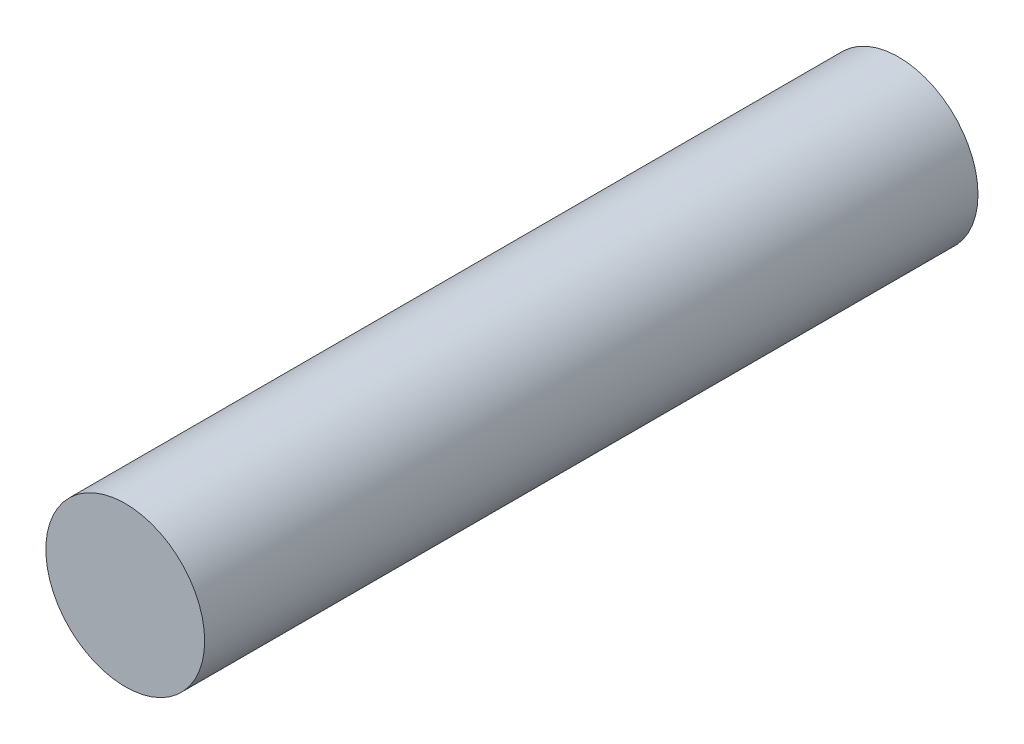
ISO-10303-21;
HEADER;
FILE_DESCRIPTION(('STEP AP214'),'2;1');
FILE_NAME('part.step','',(''),(''),'','','');
FILE_SCHEMA(('AUTOMOTIVE_DESIGN { 1 0 10303 214 1 1 1 1 }'));
ENDSEC;
DATA;
#1=APPLICATION_CONTEXT('core data for automotive mechanical design processes');
#2=APPLICATION_PROTOCOL_DEFINITION('international standard','automotive_design',2000,#1);
#3=PRODUCT_CONTEXT('',#1,'mechanical');
#4=PRODUCT('Part','Part','',(#3));
#5=PRODUCT_RELATED_PRODUCT_CATEGORY('part','',(#4));
#6=PRODUCT_DEFINITION_FORMATION('','',#4);
#7=PRODUCT_DEFINITION_CONTEXT('part definition',#1,'design');
#8=PRODUCT_DEFINITION('design','',#6,#7);
#9=PRODUCT_DEFINITION_SHAPE('','',#8);
#10=(LENGTH_UNIT() NAMED_UNIT(*) SI_UNIT(.MILLI.,.METRE.));
#11=(NAMED_UNIT(*) PLANE_ANGLE_UNIT() SI_UNIT($,.RADIAN.));
#12=(NAMED_UNIT(*) SI_UNIT($,.STERADIAN.) SOLID_ANGLE_UNIT());
#13=UNCERTAINTY_MEASURE_WITH_UNIT(LENGTH_MEASURE(1.E-05),#10,'distance_accuracy_value','');
#14=(GEOMETRIC_REPRESENTATION_CONTEXT(3) GLOBAL_UNCERTAINTY_ASSIGNED_CONTEXT((#13)) GLOBAL_UNIT_ASSIGNED_CONTEXT((#10,
#11,#12)) REPRESENTATION_CONTEXT('',''));
#15=CARTESIAN_POINT('',(0.,0.,0.));
#16=DIRECTION('',(0.,0.,1.));
#17=DIRECTION('',(1.,0.,0.));
#18=AXIS2_PLACEMENT_3D('',#15,#16,#17);
#19=CARTESIAN_POINT('',(0.,0.,56.));
#20=DIRECTION('',(0.,0.,-1.));
#21=DIRECTION('',(-1.,0.,0.));
#22=AXIS2_PLACEMENT_3D('',#19,#20,#21);
#23=CYLINDRICAL_SURFACE('',#22,5.75);
#24=CARTESIAN_POINT('',(0.,0.,56.));
#25=DIRECTION('',(0.,0.,1.));
#26=DIRECTION('',(1.,0.,0.));
#27=AXIS2_PLACEMENT_3D('',#24,#25,#26);
#28=CIRCLE('',#27,5.75);
#29=CARTESIAN_POINT('',(5.75,0.,56.));
#30=VERTEX_POINT('',#29);
#31=EDGE_CURVE('E10',#30,#30,#28,.T.);
#32=ORIENTED_EDGE('',*,*,#31,.F.);
#33=EDGE_LOOP('',(#32));
#34=FACE_BOUND('',#33,.T.);
#35=CARTESIAN_POINT('',(0.,0.,0.));
#36=DIRECTION('',(0.,0.,1.));
#37=DIRECTION('',(1.,0.,0.));
#38=AXIS2_PLACEMENT_3D('',#35,#36,#37);
#39=CIRCLE('',#38,5.75);
#40=CARTESIAN_POINT('',(5.75,0.,0.));
#41=VERTEX_POINT('',#40);
#42=EDGE_CURVE('E46',#41,#41,#39,.T.);
#43=ORIENTED_EDGE('',*,*,#42,.T.);
#44=EDGE_LOOP('',(#43));
#45=FACE_BOUND('',#44,.T.);
#46=ADVANCED_FACE('F43',(#34,#45),#23,.T.);
#47=CARTESIAN_POINT('',(0.,0.,56.));
#48=DIRECTION('',(0.,0.,1.));
#49=DIRECTION('',(1.,0.,0.));
#50=AXIS2_PLACEMENT_3D('',#47,#48,#49);
#51=PLANE('',#50);
#52=ORIENTED_EDGE('',*,*,#31,.T.);
#53=EDGE_LOOP('',(#52));
#54=FACE_BOUND('',#53,.T.);
#55=ADVANCED_FACE('F58',(#54),#51,.T.);
#56=CARTESIAN_POINT('',(0.,0.,0.));
#57=DIRECTION('',(0.,0.,1.));
#58=DIRECTION('',(1.,0.,0.));
#59=AXIS2_PLACEMENT_3D('',#56,#57,#58);
#60=PLANE('',#59);
#61=ORIENTED_EDGE('',*,*,#42,.F.);
#62=EDGE_LOOP('',(#61));
#63=FACE_BOUND('',#62,.T.);
#64=ADVANCED_FACE('F59',(#63),#60,.F.);
#65=CLOSED_SHELL('',(#46,#55,#64));
#66=MANIFOLD_SOLID_BREP('B2',#65);
#67=ADVANCED_BREP_SHAPE_REPRESENTATION('',(#18,#66),#14);
#68=SHAPE_DEFINITION_REPRESENTATION(#9,#67);
ENDSEC;
END-ISO-10303-21;
